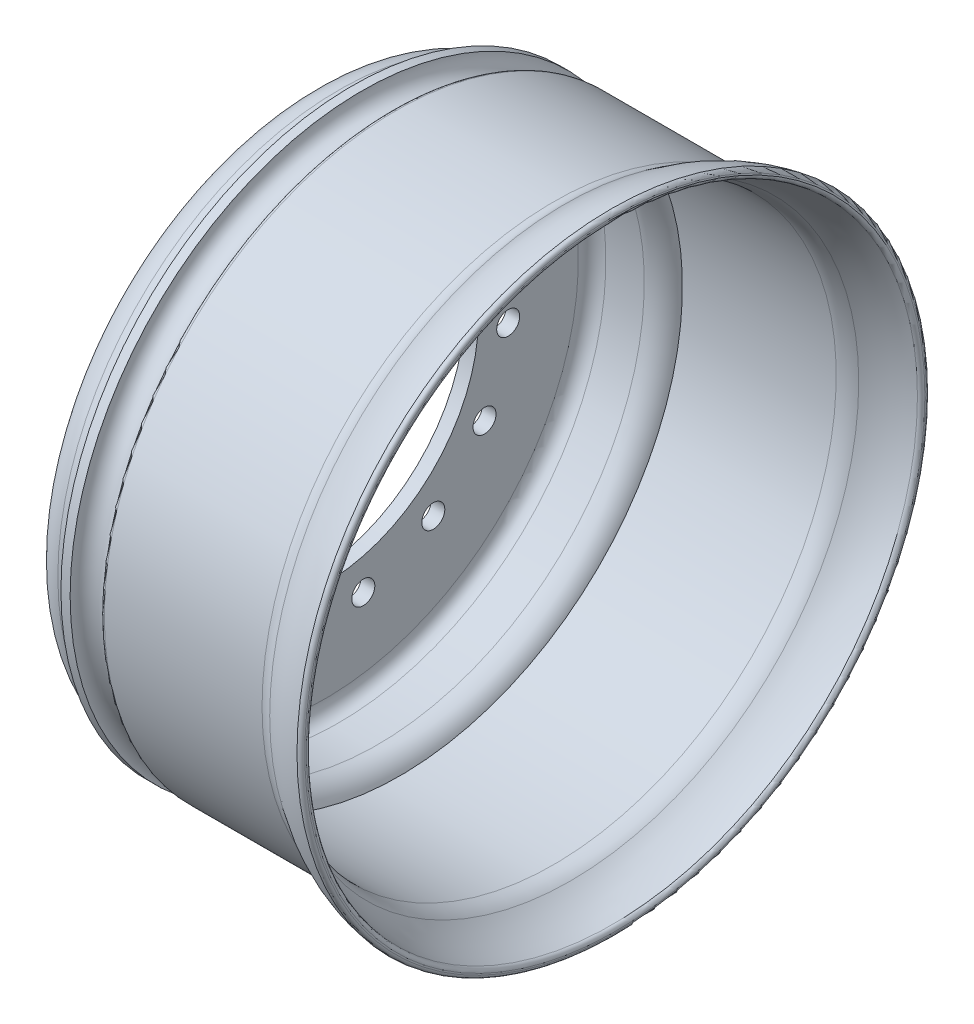
ISO-10303-21;
HEADER;
FILE_DESCRIPTION(('STEP AP214'),'2;1');
FILE_NAME('part.step','',(''),(''),'','','');
FILE_SCHEMA(('AUTOMOTIVE_DESIGN { 1 0 10303 214 1 1 1 1 }'));
ENDSEC;
DATA;
#1=APPLICATION_CONTEXT('core data for automotive mechanical design processes');
#2=APPLICATION_PROTOCOL_DEFINITION('international standard','automotive_design',2000,#1);
#3=PRODUCT_CONTEXT('',#1,'mechanical');
#4=PRODUCT('Part','Part','',(#3));
#5=PRODUCT_RELATED_PRODUCT_CATEGORY('part','',(#4));
#6=PRODUCT_DEFINITION_FORMATION('','',#4);
#7=PRODUCT_DEFINITION_CONTEXT('part definition',#1,'design');
#8=PRODUCT_DEFINITION('design','',#6,#7);
#9=PRODUCT_DEFINITION_SHAPE('','',#8);
#10=(LENGTH_UNIT() NAMED_UNIT(*) SI_UNIT(.MILLI.,.METRE.));
#11=(NAMED_UNIT(*) PLANE_ANGLE_UNIT() SI_UNIT($,.RADIAN.));
#12=(NAMED_UNIT(*) SI_UNIT($,.STERADIAN.) SOLID_ANGLE_UNIT());
#13=UNCERTAINTY_MEASURE_WITH_UNIT(LENGTH_MEASURE(1.E-05),#10,'distance_accuracy_value','');
#14=(GEOMETRIC_REPRESENTATION_CONTEXT(3) GLOBAL_UNCERTAINTY_ASSIGNED_CONTEXT((#13)) GLOBAL_UNIT_ASSIGNED_CONTEXT((#10,
#11,#12)) REPRESENTATION_CONTEXT('',''));
#15=CARTESIAN_POINT('',(0.,0.,0.));
#16=DIRECTION('',(0.,0.,1.));
#17=DIRECTION('',(1.,0.,0.));
#18=AXIS2_PLACEMENT_3D('',#15,#16,#17);
#19=CARTESIAN_POINT('',(0.,184.,0.));
#20=DIRECTION('',(1.,0.,0.));
#21=DIRECTION('',(0.,0.,-1.));
#22=AXIS2_PLACEMENT_3D('',#19,#20,#21);
#23=PLANE('',#22);
#24=CARTESIAN_POINT('',(0.,0.,0.));
#25=DIRECTION('',(-1.,0.,0.));
#26=DIRECTION('',(0.,0.,1.));
#27=AXIS2_PLACEMENT_3D('',#24,#25,#26);
#28=CIRCLE('',#27,184.);
#29=CARTESIAN_POINT('',(0.,0.,184.));
#30=VERTEX_POINT('',#29);
#31=EDGE_CURVE('E57',#30,#30,#28,.T.);
#32=ORIENTED_EDGE('',*,*,#31,.F.);
#33=EDGE_LOOP('',(#32));
#34=FACE_BOUND('',#33,.T.);
#35=CARTESIAN_POINT('',(0.,0.,0.));
#36=DIRECTION('',(-1.,0.,0.));
#37=DIRECTION('',(0.,0.,1.));
#38=AXIS2_PLACEMENT_3D('',#35,#36,#37);
#39=CIRCLE('',#38,190.);
#40=CARTESIAN_POINT('',(0.,0.,190.));
#41=VERTEX_POINT('',#40);
#42=EDGE_CURVE('E118',#41,#41,#39,.T.);
#43=ORIENTED_EDGE('',*,*,#42,.T.);
#44=EDGE_LOOP('',(#43));
#45=FACE_BOUND('',#44,.T.);
#46=ADVANCED_FACE('F31',(#34,#45),#23,.F.);
#47=CARTESIAN_POINT('',(0.,0.,0.));
#48=DIRECTION('',(-1.,0.,0.));
#49=DIRECTION('',(0.,0.,1.));
#50=AXIS2_PLACEMENT_3D('',#47,#48,#49);
#51=CYLINDRICAL_SURFACE('',#50,184.);
#52=CARTESIAN_POINT('',(1.16760302580868,0.,0.));
#53=DIRECTION('',(-1.,0.,0.));
#54=DIRECTION('',(0.,0.,1.));
#55=AXIS2_PLACEMENT_3D('',#52,#53,#54);
#56=CIRCLE('',#55,184.);
#57=CARTESIAN_POINT('',(1.16760302580868,0.,184.));
#58=VERTEX_POINT('',#57);
#59=EDGE_CURVE('E121',#58,#58,#56,.T.);
#60=ORIENTED_EDGE('',*,*,#59,.F.);
#61=EDGE_LOOP('',(#60));
#62=FACE_BOUND('',#61,.T.);
#63=ORIENTED_EDGE('',*,*,#31,.T.);
#64=EDGE_LOOP('',(#63));
#65=FACE_BOUND('',#64,.T.);
#66=ADVANCED_FACE('F254',(#62,#65),#51,.F.);
#67=CARTESIAN_POINT('',(16.,0.,0.));
#68=DIRECTION('',(-1.,0.,0.));
#69=DIRECTION('',(0.,0.,1.));
#70=AXIS2_PLACEMENT_3D('',#67,#68,#69);
#71=TOROIDAL_SURFACE('',#70,190.,16.);
#72=CARTESIAN_POINT('',(1.61250543006184,0.,0.));
#73=DIRECTION('',(-1.,0.,0.));
#74=DIRECTION('',(0.,0.,1.));
#75=AXIS2_PLACEMENT_3D('',#72,#73,#74);
#76=CIRCLE('',#75,183.);
#77=CARTESIAN_POINT('',(1.61250543006184,0.,183.));
#78=VERTEX_POINT('',#77);
#79=EDGE_CURVE('E124',#78,#78,#76,.T.);
#80=ORIENTED_EDGE('',*,*,#79,.F.);
#81=EDGE_LOOP('',(#80));
#82=FACE_BOUND('',#81,.T.);
#83=ORIENTED_EDGE('',*,*,#59,.T.);
#84=EDGE_LOOP('',(#83));
#85=FACE_BOUND('',#84,.T.);
#86=ADVANCED_FACE('F248',(#82,#85),#71,.T.);
#87=CARTESIAN_POINT('',(0.,0.,0.));
#88=DIRECTION('',(-1.,0.,0.));
#89=DIRECTION('',(0.,0.,1.));
#90=AXIS2_PLACEMENT_3D('',#87,#88,#89);
#91=CYLINDRICAL_SURFACE('',#90,183.);
#92=CARTESIAN_POINT('',(-8.99999999999999,0.,0.));
#93=DIRECTION('',(-1.,0.,0.));
#94=DIRECTION('',(0.,0.,1.));
#95=AXIS2_PLACEMENT_3D('',#92,#93,#94);
#96=CIRCLE('',#95,183.);
#97=CARTESIAN_POINT('',(-8.99999999999999,0.,183.));
#98=VERTEX_POINT('',#97);
#99=EDGE_CURVE('E127',#98,#98,#96,.T.);
#100=ORIENTED_EDGE('',*,*,#99,.F.);
#101=EDGE_LOOP('',(#100));
#102=FACE_BOUND('',#101,.T.);
#103=ORIENTED_EDGE('',*,*,#79,.T.);
#104=EDGE_LOOP('',(#103));
#105=FACE_BOUND('',#104,.T.);
#106=ADVANCED_FACE('F242',(#102,#105),#91,.T.);
#107=CARTESIAN_POINT('',(-8.99999999999999,0.,0.));
#108=DIRECTION('',(-1.,0.,0.));
#109=DIRECTION('',(0.,0.,1.));
#110=AXIS2_PLACEMENT_3D('',#107,#108,#109);
#111=TOROIDAL_SURFACE('',#110,165.,18.);
#112=CARTESIAN_POINT('',(-27.,0.,0.));
#113=DIRECTION('',(-1.,0.,0.));
#114=DIRECTION('',(0.,0.,1.));
#115=AXIS2_PLACEMENT_3D('',#112,#113,#114);
#116=CIRCLE('',#115,165.);
#117=CARTESIAN_POINT('',(-27.,0.,165.));
#118=VERTEX_POINT('',#117);
#119=EDGE_CURVE('E130',#118,#118,#116,.T.);
#120=ORIENTED_EDGE('',*,*,#119,.F.);
#121=EDGE_LOOP('',(#120));
#122=FACE_BOUND('',#121,.T.);
#123=ORIENTED_EDGE('',*,*,#99,.T.);
#124=EDGE_LOOP('',(#123));
#125=FACE_BOUND('',#124,.T.);
#126=ADVANCED_FACE('F206',(#122,#125),#111,.T.);
#127=CARTESIAN_POINT('',(-27.,100.,0.));
#128=DIRECTION('',(1.,0.,0.));
#129=DIRECTION('',(0.,0.,-1.));
#130=AXIS2_PLACEMENT_3D('',#127,#128,#129);
#131=PLANE('',#130);
#132=CARTESIAN_POINT('',(-27.,109.625454917113,48.8083971690947));
#133=DIRECTION('',(-1.,0.,0.));
#134=DIRECTION('',(0.,-0.406736643075789,0.913545457642606));
#135=AXIS2_PLACEMENT_3D('',#132,#133,#134);
#136=CIRCLE('',#135,7.5);
#137=CARTESIAN_POINT('',(-27.,106.574930094044,55.6599881014142));
#138=VERTEX_POINT('',#137);
#139=EDGE_CURVE('E62',#138,#138,#136,.T.);
#140=ORIENTED_EDGE('',*,*,#139,.F.);
#141=EDGE_LOOP('',(#140));
#142=FACE_BOUND('',#141,.T.);
#143=CARTESIAN_POINT('',(-27.,80.2956727630641,89.1773790572863));
#144=DIRECTION('',(-1.,0.,0.));
#145=DIRECTION('',(0.,-0.743144825477386,0.669130606358867));
#146=AXIS2_PLACEMENT_3D('',#143,#144,#145);
#147=CIRCLE('',#146,7.5);
#148=CARTESIAN_POINT('',(-27.,74.7220865719837,94.1958586049779));
#149=VERTEX_POINT('',#148);
#150=EDGE_CURVE('E61',#149,#149,#147,.T.);
#151=ORIENTED_EDGE('',*,*,#150,.F.);
#152=EDGE_LOOP('',(#151));
#153=FACE_BOUND('',#152,.T.);
#154=CARTESIAN_POINT('',(-27.,37.0820393249949,114.126781955418));
#155=DIRECTION('',(-1.,0.,0.));
#156=DIRECTION('',(0.,-0.95105651629515,0.309016994374957));
#157=AXIS2_PLACEMENT_3D('',#154,#155,#156);
#158=CIRCLE('',#157,7.5);
#159=CARTESIAN_POINT('',(-27.,29.9491154527813,116.44440941323));
#160=VERTEX_POINT('',#159);
#161=EDGE_CURVE('E66',#160,#160,#158,.T.);
#162=ORIENTED_EDGE('',*,*,#161,.F.);
#163=EDGE_LOOP('',(#162));
#164=FACE_BOUND('',#163,.T.);
#165=CARTESIAN_POINT('',(-27.,-12.5434155921172,119.342627444193));
#166=DIRECTION('',(-1.,0.,0.));
#167=DIRECTION('',(0.,-0.994521895368274,-0.104528463267644));
#168=AXIS2_PLACEMENT_3D('',#165,#166,#167);
#169=CIRCLE('',#168,7.5);
#170=CARTESIAN_POINT('',(-27.,-20.0023298073793,118.558663969686));
#171=VERTEX_POINT('',#170);
#172=EDGE_CURVE('E70',#171,#171,#169,.T.);
#173=ORIENTED_EDGE('',*,*,#172,.F.);
#174=EDGE_LOOP('',(#173));
#175=FACE_BOUND('',#174,.T.);
#176=CARTESIAN_POINT('',(-27.,-59.999999999999,103.923048454133));
#177=DIRECTION('',(-1.,0.,0.));
#178=DIRECTION('',(0.,-0.866025403784443,-0.499999999999992));
#179=AXIS2_PLACEMENT_3D('',#176,#177,#178);
#180=CIRCLE('',#179,7.5);
#181=CARTESIAN_POINT('',(-27.,-66.4951905283824,100.173048454133));
#182=VERTEX_POINT('',#181);
#183=EDGE_CURVE('E74',#182,#182,#180,.T.);
#184=ORIENTED_EDGE('',*,*,#183,.F.);
#185=EDGE_LOOP('',(#184));
#186=FACE_BOUND('',#185,.T.);
#187=CARTESIAN_POINT('',(-27.,-97.0820393249931,70.5342302750976));
#188=DIRECTION('',(-1.,0.,0.));
#189=DIRECTION('',(0.,-0.58778525229248,-0.809016994374943));
#190=AXIS2_PLACEMENT_3D('',#187,#188,#189);
#191=CIRCLE('',#190,7.5);
#192=CARTESIAN_POINT('',(-27.,-101.490428717187,64.4666028172855));
#193=VERTEX_POINT('',#192);
#194=EDGE_CURVE('E78',#193,#193,#191,.T.);
#195=ORIENTED_EDGE('',*,*,#194,.F.);
#196=EDGE_LOOP('',(#195));
#197=FACE_BOUND('',#196,.T.);
#198=CARTESIAN_POINT('',(-27.,-117.377712088056,24.949402898132));
#199=DIRECTION('',(-1.,0.,0.));
#200=DIRECTION('',(0.,-0.207911690817766,-0.978147600733804));
#201=AXIS2_PLACEMENT_3D('',#198,#199,#200);
#202=CIRCLE('',#201,7.5);
#203=CARTESIAN_POINT('',(-27.,-118.93704976919,17.6132958926284));
#204=VERTEX_POINT('',#203);
#205=EDGE_CURVE('E82',#204,#204,#202,.T.);
#206=ORIENTED_EDGE('',*,*,#205,.F.);
#207=EDGE_LOOP('',(#206));
#208=FACE_BOUND('',#207,.T.);
#209=CARTESIAN_POINT('',(-27.,-117.377712088057,-24.9494028981304));
#210=DIRECTION('',(-1.,0.,0.));
#211=DIRECTION('',(0.,0.207911690817753,-0.978147600733807));
#212=AXIS2_PLACEMENT_3D('',#209,#210,#211);
#213=CIRCLE('',#212,7.5);
#214=CARTESIAN_POINT('',(-27.,-115.818374406924,-32.2855099036339));
#215=VERTEX_POINT('',#214);
#216=EDGE_CURVE('E86',#215,#215,#213,.T.);
#217=ORIENTED_EDGE('',*,*,#216,.F.);
#218=EDGE_LOOP('',(#217));
#219=FACE_BOUND('',#218,.T.);
#220=CARTESIAN_POINT('',(-27.,-97.0820393249941,-70.5342302750963));
#221=DIRECTION('',(-1.,0.,0.));
#222=DIRECTION('',(0.,0.587785252292469,-0.80901699437495));
#223=AXIS2_PLACEMENT_3D('',#220,#221,#222);
#224=CIRCLE('',#223,7.5);
#225=CARTESIAN_POINT('',(-27.,-92.6736499328005,-76.6018577329084));
#226=VERTEX_POINT('',#225);
#227=EDGE_CURVE('E90',#226,#226,#224,.T.);
#228=ORIENTED_EDGE('',*,*,#227,.F.);
#229=EDGE_LOOP('',(#228));
#230=FACE_BOUND('',#229,.T.);
#231=CARTESIAN_POINT('',(-27.,-60.0000000000005,-103.923048454132));
#232=DIRECTION('',(-1.,0.,0.));
#233=DIRECTION('',(0.,0.866025403784436,-0.500000000000004));
#234=AXIS2_PLACEMENT_3D('',#231,#232,#233);
#235=CIRCLE('',#234,7.5);
#236=CARTESIAN_POINT('',(-27.,-53.5048094716172,-107.673048454132));
#237=VERTEX_POINT('',#236);
#238=EDGE_CURVE('E94',#237,#237,#235,.T.);
#239=ORIENTED_EDGE('',*,*,#238,.F.);
#240=EDGE_LOOP('',(#239));
#241=FACE_BOUND('',#240,.T.);
#242=CARTESIAN_POINT('',(-27.,-12.5434155921189,-119.342627444193));
#243=DIRECTION('',(-1.,0.,0.));
#244=DIRECTION('',(0.,0.994521895368273,-0.104528463267657));
#245=AXIS2_PLACEMENT_3D('',#242,#243,#244);
#246=CIRCLE('',#245,7.5);
#247=CARTESIAN_POINT('',(-27.,-5.0845013768568,-120.1265909187));
#248=VERTEX_POINT('',#247);
#249=EDGE_CURVE('E98',#248,#248,#246,.T.);
#250=ORIENTED_EDGE('',*,*,#249,.F.);
#251=EDGE_LOOP('',(#250));
#252=FACE_BOUND('',#251,.T.);
#253=CARTESIAN_POINT('',(-27.,37.0820393249934,-114.126781955419));
#254=DIRECTION('',(-1.,0.,0.));
#255=DIRECTION('',(0.,0.951056516295154,0.309016994374945));
#256=AXIS2_PLACEMENT_3D('',#253,#254,#255);
#257=CIRCLE('',#256,7.5);
#258=CARTESIAN_POINT('',(-27.,44.2149631972071,-111.809154497606));
#259=VERTEX_POINT('',#258);
#260=EDGE_CURVE('E102',#259,#259,#257,.T.);
#261=ORIENTED_EDGE('',*,*,#260,.F.);
#262=EDGE_LOOP('',(#261));
#263=FACE_BOUND('',#262,.T.);
#264=CARTESIAN_POINT('',(-27.,80.2956727630628,-89.1773790572875));
#265=DIRECTION('',(-1.,0.,0.));
#266=DIRECTION('',(0.,0.743144825477395,0.669130606358857));
#267=AXIS2_PLACEMENT_3D('',#264,#265,#266);
#268=CIRCLE('',#267,7.5);
#269=CARTESIAN_POINT('',(-27.,85.8692589541433,-84.158899509596));
#270=VERTEX_POINT('',#269);
#271=EDGE_CURVE('E106',#270,#270,#268,.T.);
#272=ORIENTED_EDGE('',*,*,#271,.F.);
#273=EDGE_LOOP('',(#272));
#274=FACE_BOUND('',#273,.T.);
#275=CARTESIAN_POINT('',(-27.,109.625454917112,-48.8083971690961));
#276=DIRECTION('',(-1.,0.,0.));
#277=DIRECTION('',(0.,0.406736643075801,0.913545457642601));
#278=AXIS2_PLACEMENT_3D('',#275,#276,#277);
#279=CIRCLE('',#278,7.5);
#280=CARTESIAN_POINT('',(-27.,112.675979740181,-41.9568062367766));
#281=VERTEX_POINT('',#280);
#282=EDGE_CURVE('E110',#281,#281,#279,.T.);
#283=ORIENTED_EDGE('',*,*,#282,.F.);
#284=EDGE_LOOP('',(#283));
#285=FACE_BOUND('',#284,.T.);
#286=CARTESIAN_POINT('',(-27.,120.,0.));
#287=DIRECTION('',(-1.,0.,0.));
#288=DIRECTION('',(0.,0.,1.));
#289=AXIS2_PLACEMENT_3D('',#286,#287,#288);
#290=CIRCLE('',#289,7.5);
#291=CARTESIAN_POINT('',(-27.,120.,7.5));
#292=VERTEX_POINT('',#291);
#293=EDGE_CURVE('E114',#292,#292,#290,.T.);
#294=ORIENTED_EDGE('',*,*,#293,.F.);
#295=EDGE_LOOP('',(#294));
#296=FACE_BOUND('',#295,.T.);
#297=CARTESIAN_POINT('',(-27.,0.,0.));
#298=DIRECTION('',(-1.,0.,0.));
#299=DIRECTION('',(0.,0.,1.));
#300=AXIS2_PLACEMENT_3D('',#297,#298,#299);
#301=CIRCLE('',#300,100.);
#302=CARTESIAN_POINT('',(-27.,0.,100.));
#303=VERTEX_POINT('',#302);
#304=EDGE_CURVE('E133',#303,#303,#301,.T.);
#305=ORIENTED_EDGE('',*,*,#304,.F.);
#306=EDGE_LOOP('',(#305));
#307=FACE_BOUND('',#306,.T.);
#308=ORIENTED_EDGE('',*,*,#119,.T.);
#309=EDGE_LOOP('',(#308));
#310=FACE_BOUND('',#309,.T.);
#311=ADVANCED_FACE('F202',(#142,#153,#164,#175,#186,#197,#208,#219,#230,#241,#252,#263,#274,
#285,#296,#307,#310),#131,.F.);
#312=CARTESIAN_POINT('',(0.,0.,0.));
#313=DIRECTION('',(-1.,0.,0.));
#314=DIRECTION('',(0.,0.,1.));
#315=AXIS2_PLACEMENT_3D('',#312,#313,#314);
#316=CYLINDRICAL_SURFACE('',#315,100.);
#317=CARTESIAN_POINT('',(-18.,0.,0.));
#318=DIRECTION('',(-1.,0.,0.));
#319=DIRECTION('',(0.,0.,1.));
#320=AXIS2_PLACEMENT_3D('',#317,#318,#319);
#321=CIRCLE('',#320,100.);
#322=CARTESIAN_POINT('',(-18.,0.,100.));
#323=VERTEX_POINT('',#322);
#324=EDGE_CURVE('E136',#323,#323,#321,.T.);
#325=ORIENTED_EDGE('',*,*,#324,.F.);
#326=EDGE_LOOP('',(#325));
#327=FACE_BOUND('',#326,.T.);
#328=ORIENTED_EDGE('',*,*,#304,.T.);
#329=EDGE_LOOP('',(#328));
#330=FACE_BOUND('',#329,.T.);
#331=ADVANCED_FACE('F205',(#327,#330),#316,.F.);
#332=CARTESIAN_POINT('',(-18.,165.,0.));
#333=DIRECTION('',(-1.,0.,0.));
#334=DIRECTION('',(0.,0.,1.));
#335=AXIS2_PLACEMENT_3D('',#332,#333,#334);
#336=PLANE('',#335);
#337=CARTESIAN_POINT('',(-18.,109.625454917113,48.8083971690947));
#338=DIRECTION('',(-1.,0.,0.));
#339=DIRECTION('',(0.,0.,1.));
#340=AXIS2_PLACEMENT_3D('',#337,#338,#339);
#341=CIRCLE('',#340,7.5);
#342=CARTESIAN_POINT('',(-18.,109.625454917113,56.3083971690947));
#343=VERTEX_POINT('',#342);
#344=EDGE_CURVE('E58',#343,#343,#341,.T.);
#345=ORIENTED_EDGE('',*,*,#344,.T.);
#346=EDGE_LOOP('',(#345));
#347=FACE_BOUND('',#346,.T.);
#348=CARTESIAN_POINT('',(-18.,80.2956727630641,89.1773790572863));
#349=DIRECTION('',(-1.,0.,0.));
#350=DIRECTION('',(0.,0.,1.));
#351=AXIS2_PLACEMENT_3D('',#348,#349,#350);
#352=CIRCLE('',#351,7.5);
#353=CARTESIAN_POINT('',(-18.,80.2956727630641,96.6773790572863));
#354=VERTEX_POINT('',#353);
#355=EDGE_CURVE('E63',#354,#354,#352,.T.);
#356=ORIENTED_EDGE('',*,*,#355,.T.);
#357=EDGE_LOOP('',(#356));
#358=FACE_BOUND('',#357,.T.);
#359=CARTESIAN_POINT('',(-18.,37.0820393249949,114.126781955418));
#360=DIRECTION('',(-1.,0.,0.));
#361=DIRECTION('',(0.,0.,1.));
#362=AXIS2_PLACEMENT_3D('',#359,#360,#361);
#363=CIRCLE('',#362,7.5);
#364=CARTESIAN_POINT('',(-18.,37.0820393249949,121.626781955418));
#365=VERTEX_POINT('',#364);
#366=EDGE_CURVE('E67',#365,#365,#363,.T.);
#367=ORIENTED_EDGE('',*,*,#366,.T.);
#368=EDGE_LOOP('',(#367));
#369=FACE_BOUND('',#368,.T.);
#370=CARTESIAN_POINT('',(-18.,-12.5434155921172,119.342627444193));
#371=DIRECTION('',(-1.,0.,0.));
#372=DIRECTION('',(0.,0.,1.));
#373=AXIS2_PLACEMENT_3D('',#370,#371,#372);
#374=CIRCLE('',#373,7.5);
#375=CARTESIAN_POINT('',(-18.,-12.5434155921172,126.842627444193));
#376=VERTEX_POINT('',#375);
#377=EDGE_CURVE('E71',#376,#376,#374,.T.);
#378=ORIENTED_EDGE('',*,*,#377,.T.);
#379=EDGE_LOOP('',(#378));
#380=FACE_BOUND('',#379,.T.);
#381=CARTESIAN_POINT('',(-18.,-59.999999999999,103.923048454133));
#382=DIRECTION('',(-1.,0.,0.));
#383=DIRECTION('',(0.,0.,1.));
#384=AXIS2_PLACEMENT_3D('',#381,#382,#383);
#385=CIRCLE('',#384,7.5);
#386=CARTESIAN_POINT('',(-18.,-59.999999999999,111.423048454133));
#387=VERTEX_POINT('',#386);
#388=EDGE_CURVE('E75',#387,#387,#385,.T.);
#389=ORIENTED_EDGE('',*,*,#388,.T.);
#390=EDGE_LOOP('',(#389));
#391=FACE_BOUND('',#390,.T.);
#392=CARTESIAN_POINT('',(-18.,-97.0820393249931,70.5342302750976));
#393=DIRECTION('',(-1.,0.,0.));
#394=DIRECTION('',(0.,0.,1.));
#395=AXIS2_PLACEMENT_3D('',#392,#393,#394);
#396=CIRCLE('',#395,7.5);
#397=CARTESIAN_POINT('',(-18.,-97.0820393249931,78.0342302750976));
#398=VERTEX_POINT('',#397);
#399=EDGE_CURVE('E79',#398,#398,#396,.T.);
#400=ORIENTED_EDGE('',*,*,#399,.T.);
#401=EDGE_LOOP('',(#400));
#402=FACE_BOUND('',#401,.T.);
#403=CARTESIAN_POINT('',(-18.,-117.377712088056,24.949402898132));
#404=DIRECTION('',(-1.,0.,0.));
#405=DIRECTION('',(0.,0.,1.));
#406=AXIS2_PLACEMENT_3D('',#403,#404,#405);
#407=CIRCLE('',#406,7.5);
#408=CARTESIAN_POINT('',(-18.,-117.377712088056,32.449402898132));
#409=VERTEX_POINT('',#408);
#410=EDGE_CURVE('E83',#409,#409,#407,.T.);
#411=ORIENTED_EDGE('',*,*,#410,.T.);
#412=EDGE_LOOP('',(#411));
#413=FACE_BOUND('',#412,.T.);
#414=CARTESIAN_POINT('',(-18.,-117.377712088057,-24.9494028981304));
#415=DIRECTION('',(-1.,0.,0.));
#416=DIRECTION('',(0.,0.,1.));
#417=AXIS2_PLACEMENT_3D('',#414,#415,#416);
#418=CIRCLE('',#417,7.5);
#419=CARTESIAN_POINT('',(-18.,-117.377712088057,-17.4494028981304));
#420=VERTEX_POINT('',#419);
#421=EDGE_CURVE('E87',#420,#420,#418,.T.);
#422=ORIENTED_EDGE('',*,*,#421,.T.);
#423=EDGE_LOOP('',(#422));
#424=FACE_BOUND('',#423,.T.);
#425=CARTESIAN_POINT('',(-18.,-97.0820393249941,-70.5342302750963));
#426=DIRECTION('',(-1.,0.,0.));
#427=DIRECTION('',(0.,0.,1.));
#428=AXIS2_PLACEMENT_3D('',#425,#426,#427);
#429=CIRCLE('',#428,7.5);
#430=CARTESIAN_POINT('',(-18.,-97.0820393249941,-63.0342302750963));
#431=VERTEX_POINT('',#430);
#432=EDGE_CURVE('E91',#431,#431,#429,.T.);
#433=ORIENTED_EDGE('',*,*,#432,.T.);
#434=EDGE_LOOP('',(#433));
#435=FACE_BOUND('',#434,.T.);
#436=CARTESIAN_POINT('',(-18.,-60.0000000000005,-103.923048454132));
#437=DIRECTION('',(-1.,0.,0.));
#438=DIRECTION('',(0.,0.,1.));
#439=AXIS2_PLACEMENT_3D('',#436,#437,#438);
#440=CIRCLE('',#439,7.5);
#441=CARTESIAN_POINT('',(-18.,-60.0000000000005,-96.4230484541324));
#442=VERTEX_POINT('',#441);
#443=EDGE_CURVE('E95',#442,#442,#440,.T.);
#444=ORIENTED_EDGE('',*,*,#443,.T.);
#445=EDGE_LOOP('',(#444));
#446=FACE_BOUND('',#445,.T.);
#447=CARTESIAN_POINT('',(-18.,-12.5434155921189,-119.342627444193));
#448=DIRECTION('',(-1.,0.,0.));
#449=DIRECTION('',(0.,0.,1.));
#450=AXIS2_PLACEMENT_3D('',#447,#448,#449);
#451=CIRCLE('',#450,7.5);
#452=CARTESIAN_POINT('',(-18.,-12.5434155921189,-111.842627444193));
#453=VERTEX_POINT('',#452);
#454=EDGE_CURVE('E99',#453,#453,#451,.T.);
#455=ORIENTED_EDGE('',*,*,#454,.T.);
#456=EDGE_LOOP('',(#455));
#457=FACE_BOUND('',#456,.T.);
#458=CARTESIAN_POINT('',(-18.,37.0820393249934,-114.126781955419));
#459=DIRECTION('',(-1.,0.,0.));
#460=DIRECTION('',(0.,0.,1.));
#461=AXIS2_PLACEMENT_3D('',#458,#459,#460);
#462=CIRCLE('',#461,7.5);
#463=CARTESIAN_POINT('',(-18.,37.0820393249934,-106.626781955419));
#464=VERTEX_POINT('',#463);
#465=EDGE_CURVE('E103',#464,#464,#462,.T.);
#466=ORIENTED_EDGE('',*,*,#465,.T.);
#467=EDGE_LOOP('',(#466));
#468=FACE_BOUND('',#467,.T.);
#469=CARTESIAN_POINT('',(-18.,80.2956727630628,-89.1773790572875));
#470=DIRECTION('',(-1.,0.,0.));
#471=DIRECTION('',(0.,0.,1.));
#472=AXIS2_PLACEMENT_3D('',#469,#470,#471);
#473=CIRCLE('',#472,7.5);
#474=CARTESIAN_POINT('',(-18.,80.2956727630628,-81.6773790572875));
#475=VERTEX_POINT('',#474);
#476=EDGE_CURVE('E107',#475,#475,#473,.T.);
#477=ORIENTED_EDGE('',*,*,#476,.T.);
#478=EDGE_LOOP('',(#477));
#479=FACE_BOUND('',#478,.T.);
#480=CARTESIAN_POINT('',(-18.,109.625454917112,-48.8083971690961));
#481=DIRECTION('',(-1.,0.,0.));
#482=DIRECTION('',(0.,0.,1.));
#483=AXIS2_PLACEMENT_3D('',#480,#481,#482);
#484=CIRCLE('',#483,7.5);
#485=CARTESIAN_POINT('',(-18.,109.625454917112,-41.3083971690961));
#486=VERTEX_POINT('',#485);
#487=EDGE_CURVE('E111',#486,#486,#484,.T.);
#488=ORIENTED_EDGE('',*,*,#487,.T.);
#489=EDGE_LOOP('',(#488));
#490=FACE_BOUND('',#489,.T.);
#491=CARTESIAN_POINT('',(-18.,120.,0.));
#492=DIRECTION('',(-1.,0.,0.));
#493=DIRECTION('',(0.,0.,1.));
#494=AXIS2_PLACEMENT_3D('',#491,#492,#493);
#495=CIRCLE('',#494,7.5);
#496=CARTESIAN_POINT('',(-18.,120.,7.5));
#497=VERTEX_POINT('',#496);
#498=EDGE_CURVE('E115',#497,#497,#495,.T.);
#499=ORIENTED_EDGE('',*,*,#498,.T.);
#500=EDGE_LOOP('',(#499));
#501=FACE_BOUND('',#500,.T.);
#502=CARTESIAN_POINT('',(-18.,0.,0.));
#503=DIRECTION('',(-1.,0.,0.));
#504=DIRECTION('',(0.,0.,1.));
#505=AXIS2_PLACEMENT_3D('',#502,#503,#504);
#506=CIRCLE('',#505,165.);
#507=CARTESIAN_POINT('',(-18.,0.,165.));
#508=VERTEX_POINT('',#507);
#509=EDGE_CURVE('E139',#508,#508,#506,.T.);
#510=ORIENTED_EDGE('',*,*,#509,.F.);
#511=EDGE_LOOP('',(#510));
#512=FACE_BOUND('',#511,.T.);
#513=ORIENTED_EDGE('',*,*,#324,.T.);
#514=EDGE_LOOP('',(#513));
#515=FACE_BOUND('',#514,.T.);
#516=ADVANCED_FACE('F320',(#347,#358,#369,#380,#391,#402,#413,#424,#435,#446,#457,#468,#479,
#490,#501,#512,#515),#336,.F.);
#517=CARTESIAN_POINT('',(-8.99999999999999,0.,0.));
#518=DIRECTION('',(-1.,0.,0.));
#519=DIRECTION('',(0.,0.,1.));
#520=AXIS2_PLACEMENT_3D('',#517,#518,#519);
#521=TOROIDAL_SURFACE('',#520,165.,9.00000000000001);
#522=CARTESIAN_POINT('',(-9.,0.,0.));
#523=DIRECTION('',(-1.,0.,0.));
#524=DIRECTION('',(0.,0.,1.));
#525=AXIS2_PLACEMENT_3D('',#522,#523,#524);
#526=CIRCLE('',#525,174.);
#527=CARTESIAN_POINT('',(-9.,0.,174.));
#528=VERTEX_POINT('',#527);
#529=EDGE_CURVE('E142',#528,#528,#526,.T.);
#530=ORIENTED_EDGE('',*,*,#529,.F.);
#531=EDGE_LOOP('',(#530));
#532=FACE_BOUND('',#531,.T.);
#533=ORIENTED_EDGE('',*,*,#509,.T.);
#534=EDGE_LOOP('',(#533));
#535=FACE_BOUND('',#534,.T.);
#536=ADVANCED_FACE('F316',(#532,#535),#521,.F.);
#537=CARTESIAN_POINT('',(0.,0.,0.));
#538=DIRECTION('',(-1.,0.,0.));
#539=DIRECTION('',(0.,0.,1.));
#540=AXIS2_PLACEMENT_3D('',#537,#538,#539);
#541=CYLINDRICAL_SURFACE('',#540,174.);
#542=CARTESIAN_POINT('',(16.,0.,0.));
#543=DIRECTION('',(-1.,0.,0.));
#544=DIRECTION('',(0.,0.,1.));
#545=AXIS2_PLACEMENT_3D('',#542,#543,#544);
#546=CIRCLE('',#545,174.);
#547=CARTESIAN_POINT('',(16.,0.,174.));
#548=VERTEX_POINT('',#547);
#549=EDGE_CURVE('E145',#548,#548,#546,.T.);
#550=ORIENTED_EDGE('',*,*,#549,.F.);
#551=EDGE_LOOP('',(#550));
#552=FACE_BOUND('',#551,.T.);
#553=ORIENTED_EDGE('',*,*,#529,.T.);
#554=EDGE_LOOP('',(#553));
#555=FACE_BOUND('',#554,.T.);
#556=ADVANCED_FACE('F312',(#552,#555),#541,.F.);
#557=CARTESIAN_POINT('',(16.,0.,0.));
#558=DIRECTION('',(-1.,0.,0.));
#559=DIRECTION('',(0.,0.,1.));
#560=AXIS2_PLACEMENT_3D('',#557,#558,#559);
#561=TOROIDAL_SURFACE('',#560,190.,16.);
#562=CARTESIAN_POINT('',(30.8323969741913,0.,0.));
#563=DIRECTION('',(-1.,0.,0.));
#564=DIRECTION('',(0.,0.,1.));
#565=AXIS2_PLACEMENT_3D('',#562,#563,#564);
#566=CIRCLE('',#565,184.);
#567=CARTESIAN_POINT('',(30.8323969741913,0.,184.));
#568=VERTEX_POINT('',#567);
#569=EDGE_CURVE('E148',#568,#568,#566,.T.);
#570=ORIENTED_EDGE('',*,*,#569,.F.);
#571=EDGE_LOOP('',(#570));
#572=FACE_BOUND('',#571,.T.);
#573=ORIENTED_EDGE('',*,*,#549,.T.);
#574=EDGE_LOOP('',(#573));
#575=FACE_BOUND('',#574,.T.);
#576=ADVANCED_FACE('F308',(#572,#575),#561,.T.);
#577=CARTESIAN_POINT('',(0.,0.,0.));
#578=DIRECTION('',(-1.,0.,0.));
#579=DIRECTION('',(0.,0.,1.));
#580=AXIS2_PLACEMENT_3D('',#577,#578,#579);
#581=CYLINDRICAL_SURFACE('',#580,184.);
#582=CARTESIAN_POINT('',(131.,0.,0.));
#583=DIRECTION('',(-1.,0.,0.));
#584=DIRECTION('',(0.,0.,1.));
#585=AXIS2_PLACEMENT_3D('',#582,#583,#584);
#586=CIRCLE('',#585,184.);
#587=CARTESIAN_POINT('',(131.,0.,184.));
#588=VERTEX_POINT('',#587);
#589=EDGE_CURVE('E151',#588,#588,#586,.T.);
#590=ORIENTED_EDGE('',*,*,#589,.F.);
#591=EDGE_LOOP('',(#590));
#592=FACE_BOUND('',#591,.T.);
#593=ORIENTED_EDGE('',*,*,#569,.T.);
#594=EDGE_LOOP('',(#593));
#595=FACE_BOUND('',#594,.T.);
#596=ADVANCED_FACE('F304',(#592,#595),#581,.F.);
#597=CARTESIAN_POINT('',(131.,0.,0.));
#598=DIRECTION('',(-1.,0.,0.));
#599=DIRECTION('',(0.,0.,1.));
#600=AXIS2_PLACEMENT_3D('',#597,#598,#599);
#601=TOROIDAL_SURFACE('',#600,202.5,18.5);
#602=CARTESIAN_POINT('',(142.021196184097,0.,0.));
#603=DIRECTION('',(-1.,0.,0.));
#604=DIRECTION('',(0.,0.,1.));
#605=AXIS2_PLACEMENT_3D('',#602,#603,#604);
#606=CIRCLE('',#605,187.641223648239);
#607=CARTESIAN_POINT('',(142.021196184097,0.,187.641223648239));
#608=VERTEX_POINT('',#607);
#609=EDGE_CURVE('E154',#608,#608,#606,.T.);
#610=ORIENTED_EDGE('',*,*,#609,.F.);
#611=EDGE_LOOP('',(#610));
#612=FACE_BOUND('',#611,.T.);
#613=ORIENTED_EDGE('',*,*,#589,.T.);
#614=EDGE_LOOP('',(#613));
#615=FACE_BOUND('',#614,.T.);
#616=ADVANCED_FACE('F300',(#612,#615),#601,.T.);
#617=CARTESIAN_POINT('',(177.169875906353,0.,0.));
#618=DIRECTION('',(-1.,0.,0.));
#619=DIRECTION('',(0.,0.,1.));
#620=AXIS2_PLACEMENT_3D('',#617,#618,#619);
#621=TOROIDAL_SURFACE('',#620,140.253774742624,59.);
#622=CARTESIAN_POINT('',(169.186611256367,0.,0.));
#623=DIRECTION('',(1.,0.,0.));
#624=DIRECTION('',(0.,0.,-1.));
#625=AXIS2_PLACEMENT_3D('',#622,#623,#624);
#626=CIRCLE('',#625,198.711173637275);
#627=CARTESIAN_POINT('',(169.186611256367,0.,-198.711173637275));
#628=VERTEX_POINT('',#627);
#629=EDGE_CURVE('E46',#628,#628,#626,.T.);
#630=ORIENTED_EDGE('',*,*,#629,.T.);
#631=EDGE_LOOP('',(#630));
#632=FACE_BOUND('',#631,.T.);
#633=ORIENTED_EDGE('',*,*,#609,.T.);
#634=EDGE_LOOP('',(#633));
#635=FACE_BOUND('',#634,.T.);
#636=ADVANCED_FACE('F296',(#632,#635),#621,.F.);
#637=CARTESIAN_POINT('',(171.56952700674,0.,0.));
#638=DIRECTION('',(-1.,0.,0.));
#639=DIRECTION('',(0.,0.,1.));
#640=AXIS2_PLACEMENT_3D('',#637,#638,#639);
#641=CONICAL_SURFACE('',#640,198.987377494393,1.47573203755627);
#642=CARTESIAN_POINT('',(171.337049311527,0.,0.));
#643=DIRECTION('',(1.,0.,0.));
#644=DIRECTION('',(0.,0.,-1.));
#645=AXIS2_PLACEMENT_3D('',#642,#643,#644);
#646=CIRCLE('',#645,201.425484984489);
#647=CARTESIAN_POINT('',(171.337049311527,0.,-201.425484984489));
#648=VERTEX_POINT('',#647);
#649=EDGE_CURVE('E51',#648,#648,#646,.F.);
#650=ORIENTED_EDGE('',*,*,#649,.T.);
#651=EDGE_LOOP('',(#650));
#652=FACE_BOUND('',#651,.T.);
#653=CARTESIAN_POINT('',(171.242050877808,0.,0.));
#654=DIRECTION('',(1.,0.,0.));
#655=DIRECTION('',(0.,0.,-1.));
#656=AXIS2_PLACEMENT_3D('',#653,#654,#655);
#657=CIRCLE('',#656,202.421780102544);
#658=CARTESIAN_POINT('',(171.242050877808,0.,-202.421780102544));
#659=VERTEX_POINT('',#658);
#660=EDGE_CURVE('E54',#659,#659,#657,.T.);
#661=ORIENTED_EDGE('',*,*,#660,.T.);
#662=EDGE_LOOP('',(#661));
#663=FACE_BOUND('',#662,.T.);
#664=ADVANCED_FACE('F292',(#652,#663),#641,.T.);
#665=CARTESIAN_POINT('',(177.169875906353,0.,0.));
#666=DIRECTION('',(-1.,0.,0.));
#667=DIRECTION('',(0.,0.,1.));
#668=AXIS2_PLACEMENT_3D('',#665,#666,#667);
#669=TOROIDAL_SURFACE('',#668,140.253774742624,65.);
#670=CARTESIAN_POINT('',(168.416677416419,0.,0.));
#671=DIRECTION('',(1.,0.,0.));
#672=DIRECTION('',(0.,0.,-1.));
#673=AXIS2_PLACEMENT_3D('',#670,#671,#672);
#674=CIRCLE('',#673,204.661705280686);
#675=CARTESIAN_POINT('',(168.416677416419,0.,-204.661705280686));
#676=VERTEX_POINT('',#675);
#677=EDGE_CURVE('E42',#676,#676,#674,.F.);
#678=ORIENTED_EDGE('',*,*,#677,.T.);
#679=EDGE_LOOP('',(#678));
#680=FACE_BOUND('',#679,.T.);
#681=CARTESIAN_POINT('',(138.446754178444,0.,0.));
#682=DIRECTION('',(-1.,0.,0.));
#683=DIRECTION('',(0.,0.,1.));
#684=AXIS2_PLACEMENT_3D('',#681,#682,#683);
#685=CIRCLE('',#684,192.46028624881);
#686=CARTESIAN_POINT('',(138.446754178444,0.,192.46028624881));
#687=VERTEX_POINT('',#686);
#688=EDGE_CURVE('E157',#687,#687,#685,.T.);
#689=ORIENTED_EDGE('',*,*,#688,.F.);
#690=EDGE_LOOP('',(#689));
#691=FACE_BOUND('',#690,.T.);
#692=ADVANCED_FACE('F288',(#680,#691),#669,.T.);
#693=CARTESIAN_POINT('',(131.,0.,0.));
#694=DIRECTION('',(-1.,0.,0.));
#695=DIRECTION('',(0.,0.,1.));
#696=AXIS2_PLACEMENT_3D('',#693,#694,#695);
#697=TOROIDAL_SURFACE('',#696,202.5,12.5);
#698=CARTESIAN_POINT('',(131.,0.,0.));
#699=DIRECTION('',(-1.,0.,0.));
#700=DIRECTION('',(0.,0.,1.));
#701=AXIS2_PLACEMENT_3D('',#698,#699,#700);
#702=CIRCLE('',#701,190.);
#703=CARTESIAN_POINT('',(131.,0.,190.));
#704=VERTEX_POINT('',#703);
#705=EDGE_CURVE('E160',#704,#704,#702,.T.);
#706=ORIENTED_EDGE('',*,*,#705,.F.);
#707=EDGE_LOOP('',(#706));
#708=FACE_BOUND('',#707,.T.);
#709=ORIENTED_EDGE('',*,*,#688,.T.);
#710=EDGE_LOOP('',(#709));
#711=FACE_BOUND('',#710,.T.);
#712=ADVANCED_FACE('F282',(#708,#711),#697,.F.);
#713=CARTESIAN_POINT('',(0.,0.,0.));
#714=DIRECTION('',(-1.,0.,0.));
#715=DIRECTION('',(0.,0.,1.));
#716=AXIS2_PLACEMENT_3D('',#713,#714,#715);
#717=CYLINDRICAL_SURFACE('',#716,190.);
#718=CARTESIAN_POINT('',(28.2474487139159,0.,0.));
#719=DIRECTION('',(1.,0.,0.));
#720=DIRECTION('',(0.,0.,-1.));
#721=AXIS2_PLACEMENT_3D('',#718,#719,#720);
#722=CIRCLE('',#721,190.);
#723=CARTESIAN_POINT('',(28.2474487139159,0.,-190.));
#724=VERTEX_POINT('',#723);
#725=EDGE_CURVE('E10',#724,#724,#722,.T.);
#726=ORIENTED_EDGE('',*,*,#725,.T.);
#727=EDGE_LOOP('',(#726));
#728=FACE_BOUND('',#727,.T.);
#729=ORIENTED_EDGE('',*,*,#705,.T.);
#730=EDGE_LOOP('',(#729));
#731=FACE_BOUND('',#730,.T.);
#732=ADVANCED_FACE('F277',(#728,#731),#717,.T.);
#733=CARTESIAN_POINT('',(16.,0.,0.));
#734=DIRECTION('',(-1.,0.,0.));
#735=DIRECTION('',(0.,0.,1.));
#736=AXIS2_PLACEMENT_3D('',#733,#734,#735);
#737=TOROIDAL_SURFACE('',#736,190.,10.);
#738=CARTESIAN_POINT('',(25.7979589711458,0.,0.));
#739=DIRECTION('',(-1.,0.,0.));
#740=DIRECTION('',(0.,0.,1.));
#741=AXIS2_PLACEMENT_3D('',#738,#739,#740);
#742=CIRCLE('',#741,187.999999999997);
#743=CARTESIAN_POINT('',(25.7979589711458,0.,187.999999999997));
#744=VERTEX_POINT('',#743);
#745=EDGE_CURVE('E38',#744,#744,#742,.T.);
#746=ORIENTED_EDGE('',*,*,#745,.T.);
#747=EDGE_LOOP('',(#746));
#748=FACE_BOUND('',#747,.T.);
#749=CARTESIAN_POINT('',(6.,0.,0.));
#750=DIRECTION('',(-1.,0.,0.));
#751=DIRECTION('',(0.,0.,1.));
#752=AXIS2_PLACEMENT_3D('',#749,#750,#751);
#753=CIRCLE('',#752,190.);
#754=CARTESIAN_POINT('',(6.,0.,190.));
#755=VERTEX_POINT('',#754);
#756=EDGE_CURVE('E163',#755,#755,#753,.T.);
#757=ORIENTED_EDGE('',*,*,#756,.F.);
#758=EDGE_LOOP('',(#757));
#759=FACE_BOUND('',#758,.T.);
#760=ADVANCED_FACE('F272',(#748,#759),#737,.F.);
#761=CARTESIAN_POINT('',(0.,0.,0.));
#762=DIRECTION('',(-1.,0.,0.));
#763=DIRECTION('',(0.,0.,1.));
#764=AXIS2_PLACEMENT_3D('',#761,#762,#763);
#765=CYLINDRICAL_SURFACE('',#764,190.);
#766=ORIENTED_EDGE('',*,*,#42,.F.);
#767=EDGE_LOOP('',(#766));
#768=FACE_BOUND('',#767,.T.);
#769=ORIENTED_EDGE('',*,*,#756,.T.);
#770=EDGE_LOOP('',(#769));
#771=FACE_BOUND('',#770,.T.);
#772=ADVANCED_FACE('F268',(#768,#771),#765,.T.);
#773=CARTESIAN_POINT('',(171.56952700674,120.,0.));
#774=DIRECTION('',(-1.,0.,0.));
#775=DIRECTION('',(0.,0.,1.));
#776=AXIS2_PLACEMENT_3D('',#773,#774,#775);
#777=CYLINDRICAL_SURFACE('',#776,7.5);
#778=ORIENTED_EDGE('',*,*,#293,.T.);
#779=EDGE_LOOP('',(#778));
#780=FACE_BOUND('',#779,.T.);
#781=ORIENTED_EDGE('',*,*,#498,.F.);
#782=EDGE_LOOP('',(#781));
#783=FACE_BOUND('',#782,.T.);
#784=ADVANCED_FACE('F271',(#780,#783),#777,.F.);
#785=CARTESIAN_POINT('',(171.56952700674,109.625454917112,-48.8083971690961));
#786=DIRECTION('',(-1.,0.,0.));
#787=DIRECTION('',(0.,0.,1.));
#788=AXIS2_PLACEMENT_3D('',#785,#786,#787);
#789=CYLINDRICAL_SURFACE('',#788,7.5);
#790=ORIENTED_EDGE('',*,*,#282,.T.);
#791=EDGE_LOOP('',(#790));
#792=FACE_BOUND('',#791,.T.);
#793=ORIENTED_EDGE('',*,*,#487,.F.);
#794=EDGE_LOOP('',(#793));
#795=FACE_BOUND('',#794,.T.);
#796=ADVANCED_FACE('F517',(#792,#795),#789,.F.);
#797=CARTESIAN_POINT('',(171.56952700674,80.2956727630628,-89.1773790572875));
#798=DIRECTION('',(-1.,0.,0.));
#799=DIRECTION('',(0.,0.,1.));
#800=AXIS2_PLACEMENT_3D('',#797,#798,#799);
#801=CYLINDRICAL_SURFACE('',#800,7.5);
#802=ORIENTED_EDGE('',*,*,#271,.T.);
#803=EDGE_LOOP('',(#802));
#804=FACE_BOUND('',#803,.T.);
#805=ORIENTED_EDGE('',*,*,#476,.F.);
#806=EDGE_LOOP('',(#805));
#807=FACE_BOUND('',#806,.T.);
#808=ADVANCED_FACE('F507',(#804,#807),#801,.F.);
#809=CARTESIAN_POINT('',(171.56952700674,37.0820393249934,-114.126781955419));
#810=DIRECTION('',(-1.,0.,0.));
#811=DIRECTION('',(0.,0.,1.));
#812=AXIS2_PLACEMENT_3D('',#809,#810,#811);
#813=CYLINDRICAL_SURFACE('',#812,7.5);
#814=ORIENTED_EDGE('',*,*,#260,.T.);
#815=EDGE_LOOP('',(#814));
#816=FACE_BOUND('',#815,.T.);
#817=ORIENTED_EDGE('',*,*,#465,.F.);
#818=EDGE_LOOP('',(#817));
#819=FACE_BOUND('',#818,.T.);
#820=ADVANCED_FACE('F497',(#816,#819),#813,.F.);
#821=CARTESIAN_POINT('',(171.56952700674,-12.5434155921189,-119.342627444193));
#822=DIRECTION('',(-1.,0.,0.));
#823=DIRECTION('',(0.,0.,1.));
#824=AXIS2_PLACEMENT_3D('',#821,#822,#823);
#825=CYLINDRICAL_SURFACE('',#824,7.5);
#826=ORIENTED_EDGE('',*,*,#249,.T.);
#827=EDGE_LOOP('',(#826));
#828=FACE_BOUND('',#827,.T.);
#829=ORIENTED_EDGE('',*,*,#454,.F.);
#830=EDGE_LOOP('',(#829));
#831=FACE_BOUND('',#830,.T.);
#832=ADVANCED_FACE('F487',(#828,#831),#825,.F.);
#833=CARTESIAN_POINT('',(171.56952700674,-60.0000000000005,-103.923048454132));
#834=DIRECTION('',(-1.,0.,0.));
#835=DIRECTION('',(0.,0.,1.));
#836=AXIS2_PLACEMENT_3D('',#833,#834,#835);
#837=CYLINDRICAL_SURFACE('',#836,7.5);
#838=ORIENTED_EDGE('',*,*,#238,.T.);
#839=EDGE_LOOP('',(#838));
#840=FACE_BOUND('',#839,.T.);
#841=ORIENTED_EDGE('',*,*,#443,.F.);
#842=EDGE_LOOP('',(#841));
#843=FACE_BOUND('',#842,.T.);
#844=ADVANCED_FACE('F477',(#840,#843),#837,.F.);
#845=CARTESIAN_POINT('',(171.56952700674,-97.0820393249941,-70.5342302750963));
#846=DIRECTION('',(-1.,0.,0.));
#847=DIRECTION('',(0.,0.,1.));
#848=AXIS2_PLACEMENT_3D('',#845,#846,#847);
#849=CYLINDRICAL_SURFACE('',#848,7.5);
#850=ORIENTED_EDGE('',*,*,#227,.T.);
#851=EDGE_LOOP('',(#850));
#852=FACE_BOUND('',#851,.T.);
#853=ORIENTED_EDGE('',*,*,#432,.F.);
#854=EDGE_LOOP('',(#853));
#855=FACE_BOUND('',#854,.T.);
#856=ADVANCED_FACE('F467',(#852,#855),#849,.F.);
#857=CARTESIAN_POINT('',(171.56952700674,-117.377712088057,-24.9494028981304));
#858=DIRECTION('',(-1.,0.,0.));
#859=DIRECTION('',(0.,0.,1.));
#860=AXIS2_PLACEMENT_3D('',#857,#858,#859);
#861=CYLINDRICAL_SURFACE('',#860,7.5);
#862=ORIENTED_EDGE('',*,*,#216,.T.);
#863=EDGE_LOOP('',(#862));
#864=FACE_BOUND('',#863,.T.);
#865=ORIENTED_EDGE('',*,*,#421,.F.);
#866=EDGE_LOOP('',(#865));
#867=FACE_BOUND('',#866,.T.);
#868=ADVANCED_FACE('F457',(#864,#867),#861,.F.);
#869=CARTESIAN_POINT('',(171.56952700674,-117.377712088056,24.949402898132));
#870=DIRECTION('',(-1.,0.,0.));
#871=DIRECTION('',(0.,0.,1.));
#872=AXIS2_PLACEMENT_3D('',#869,#870,#871);
#873=CYLINDRICAL_SURFACE('',#872,7.5);
#874=ORIENTED_EDGE('',*,*,#205,.T.);
#875=EDGE_LOOP('',(#874));
#876=FACE_BOUND('',#875,.T.);
#877=ORIENTED_EDGE('',*,*,#410,.F.);
#878=EDGE_LOOP('',(#877));
#879=FACE_BOUND('',#878,.T.);
#880=ADVANCED_FACE('F447',(#876,#879),#873,.F.);
#881=CARTESIAN_POINT('',(171.56952700674,-97.0820393249931,70.5342302750976));
#882=DIRECTION('',(-1.,0.,0.));
#883=DIRECTION('',(0.,0.,1.));
#884=AXIS2_PLACEMENT_3D('',#881,#882,#883);
#885=CYLINDRICAL_SURFACE('',#884,7.5);
#886=ORIENTED_EDGE('',*,*,#194,.T.);
#887=EDGE_LOOP('',(#886));
#888=FACE_BOUND('',#887,.T.);
#889=ORIENTED_EDGE('',*,*,#399,.F.);
#890=EDGE_LOOP('',(#889));
#891=FACE_BOUND('',#890,.T.);
#892=ADVANCED_FACE('F437',(#888,#891),#885,.F.);
#893=CARTESIAN_POINT('',(171.56952700674,-59.999999999999,103.923048454133));
#894=DIRECTION('',(-1.,0.,0.));
#895=DIRECTION('',(0.,0.,1.));
#896=AXIS2_PLACEMENT_3D('',#893,#894,#895);
#897=CYLINDRICAL_SURFACE('',#896,7.5);
#898=ORIENTED_EDGE('',*,*,#183,.T.);
#899=EDGE_LOOP('',(#898));
#900=FACE_BOUND('',#899,.T.);
#901=ORIENTED_EDGE('',*,*,#388,.F.);
#902=EDGE_LOOP('',(#901));
#903=FACE_BOUND('',#902,.T.);
#904=ADVANCED_FACE('F427',(#900,#903),#897,.F.);
#905=CARTESIAN_POINT('',(171.56952700674,-12.5434155921172,119.342627444193));
#906=DIRECTION('',(-1.,0.,0.));
#907=DIRECTION('',(0.,0.,1.));
#908=AXIS2_PLACEMENT_3D('',#905,#906,#907);
#909=CYLINDRICAL_SURFACE('',#908,7.5);
#910=ORIENTED_EDGE('',*,*,#172,.T.);
#911=EDGE_LOOP('',(#910));
#912=FACE_BOUND('',#911,.T.);
#913=ORIENTED_EDGE('',*,*,#377,.F.);
#914=EDGE_LOOP('',(#913));
#915=FACE_BOUND('',#914,.T.);
#916=ADVANCED_FACE('F417',(#912,#915),#909,.F.);
#917=CARTESIAN_POINT('',(171.56952700674,37.0820393249949,114.126781955418));
#918=DIRECTION('',(-1.,0.,0.));
#919=DIRECTION('',(0.,0.,1.));
#920=AXIS2_PLACEMENT_3D('',#917,#918,#919);
#921=CYLINDRICAL_SURFACE('',#920,7.5);
#922=ORIENTED_EDGE('',*,*,#161,.T.);
#923=EDGE_LOOP('',(#922));
#924=FACE_BOUND('',#923,.T.);
#925=ORIENTED_EDGE('',*,*,#366,.F.);
#926=EDGE_LOOP('',(#925));
#927=FACE_BOUND('',#926,.T.);
#928=ADVANCED_FACE('F407',(#924,#927),#921,.F.);
#929=CARTESIAN_POINT('',(171.56952700674,80.2956727630641,89.1773790572863));
#930=DIRECTION('',(-1.,0.,0.));
#931=DIRECTION('',(0.,0.,1.));
#932=AXIS2_PLACEMENT_3D('',#929,#930,#931);
#933=CYLINDRICAL_SURFACE('',#932,7.5);
#934=ORIENTED_EDGE('',*,*,#150,.T.);
#935=EDGE_LOOP('',(#934));
#936=FACE_BOUND('',#935,.T.);
#937=ORIENTED_EDGE('',*,*,#355,.F.);
#938=EDGE_LOOP('',(#937));
#939=FACE_BOUND('',#938,.T.);
#940=ADVANCED_FACE('F398',(#936,#939),#933,.F.);
#941=CARTESIAN_POINT('',(171.56952700674,109.625454917113,48.8083971690947));
#942=DIRECTION('',(-1.,0.,0.));
#943=DIRECTION('',(0.,0.,1.));
#944=AXIS2_PLACEMENT_3D('',#941,#942,#943);
#945=CYLINDRICAL_SURFACE('',#944,7.5);
#946=ORIENTED_EDGE('',*,*,#139,.T.);
#947=EDGE_LOOP('',(#946));
#948=FACE_BOUND('',#947,.T.);
#949=ORIENTED_EDGE('',*,*,#344,.F.);
#950=EDGE_LOOP('',(#949));
#951=FACE_BOUND('',#950,.T.);
#952=ADVANCED_FACE('F199',(#948,#951),#945,.F.);
#953=CARTESIAN_POINT('',(168.84833733052,0.,0.));
#954=DIRECTION('',(1.,0.,0.));
#955=DIRECTION('',(0.,0.,-1.));
#956=AXIS2_PLACEMENT_3D('',#953,#954,#955);
#957=TOROIDAL_SURFACE('',#956,201.188182065014,2.5);
#958=ORIENTED_EDGE('',*,*,#629,.F.);
#959=EDGE_LOOP('',(#958));
#960=FACE_BOUND('',#959,.T.);
#961=ORIENTED_EDGE('',*,*,#649,.F.);
#962=EDGE_LOOP('',(#961));
#963=FACE_BOUND('',#962,.T.);
#964=ADVANCED_FACE('F328',(#960,#963),#957,.T.);
#965=CARTESIAN_POINT('',(168.753338896801,0.,0.));
#966=DIRECTION('',(1.,0.,0.));
#967=DIRECTION('',(0.,0.,-1.));
#968=AXIS2_PLACEMENT_3D('',#965,#966,#967);
#969=TOROIDAL_SURFACE('',#968,202.184477183068,2.5);
#970=ORIENTED_EDGE('',*,*,#660,.F.);
#971=EDGE_LOOP('',(#970));
#972=FACE_BOUND('',#971,.T.);
#973=ORIENTED_EDGE('',*,*,#677,.F.);
#974=EDGE_LOOP('',(#973));
#975=FACE_BOUND('',#974,.T.);
#976=ADVANCED_FACE('F330',(#972,#975),#969,.T.);
#977=CARTESIAN_POINT('',(28.2474487139159,0.,0.));
#978=DIRECTION('',(1.,0.,0.));
#979=DIRECTION('',(0.,0.,-1.));
#980=AXIS2_PLACEMENT_3D('',#977,#978,#979);
#981=TOROIDAL_SURFACE('',#980,187.5,2.5);
#982=ORIENTED_EDGE('',*,*,#725,.F.);
#983=EDGE_LOOP('',(#982));
#984=FACE_BOUND('',#983,.T.);
#985=ORIENTED_EDGE('',*,*,#745,.F.);
#986=EDGE_LOOP('',(#985));
#987=FACE_BOUND('',#986,.T.);
#988=ADVANCED_FACE('F33',(#984,#987),#981,.T.);
#989=CLOSED_SHELL('',(#46,#66,#86,#106,#126,#311,#331,#516,#536,#556,#576,#596,#616,#636,#664,
#692,#712,#732,#760,#772,#784,#796,#808,#820,#832,#844,#856,#868,#880,#892,#904,#916,#928,#940,
#952,#964,#976,#988));
#990=MANIFOLD_SOLID_BREP('B2',#989);
#991=ADVANCED_BREP_SHAPE_REPRESENTATION('',(#18,#990),#14);
#992=SHAPE_DEFINITION_REPRESENTATION(#9,#991);
ENDSEC;
END-ISO-10303-21;
